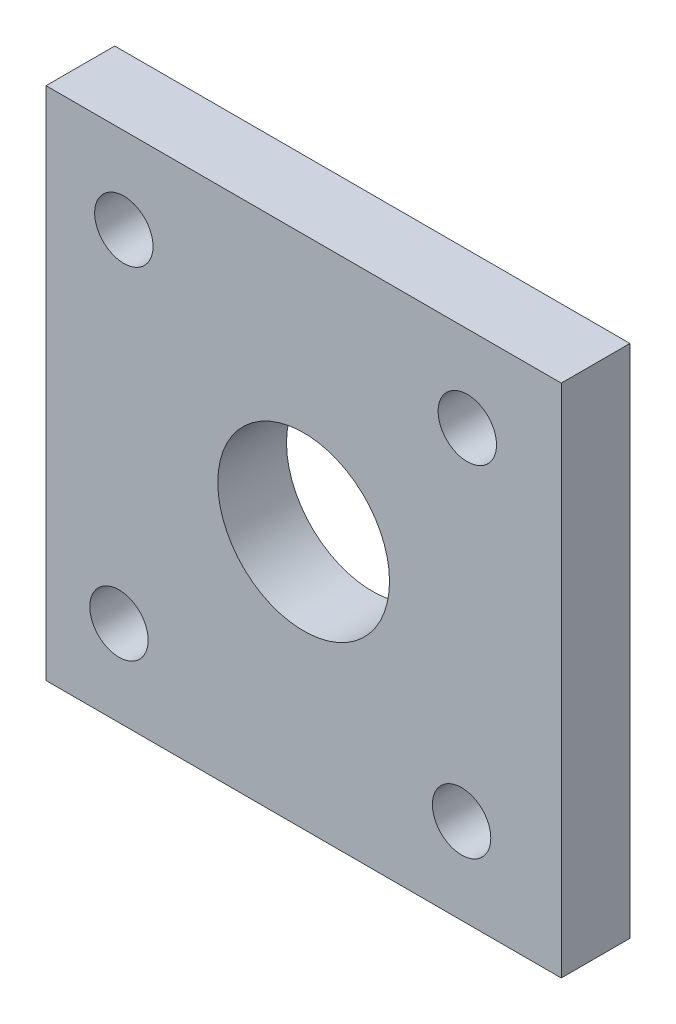
ISO-10303-21;
HEADER;
FILE_DESCRIPTION(('STEP AP214'),'2;1');
FILE_NAME('part.step','',(''),(''),'','','');
FILE_SCHEMA(('AUTOMOTIVE_DESIGN { 1 0 10303 214 1 1 1 1 }'));
ENDSEC;
DATA;
#1=APPLICATION_CONTEXT('core data for automotive mechanical design processes');
#2=APPLICATION_PROTOCOL_DEFINITION('international standard','automotive_design',2000,#1);
#3=PRODUCT_CONTEXT('',#1,'mechanical');
#4=PRODUCT('Part','Part','',(#3));
#5=PRODUCT_RELATED_PRODUCT_CATEGORY('part','',(#4));
#6=PRODUCT_DEFINITION_FORMATION('','',#4);
#7=PRODUCT_DEFINITION_CONTEXT('part definition',#1,'design');
#8=PRODUCT_DEFINITION('design','',#6,#7);
#9=PRODUCT_DEFINITION_SHAPE('','',#8);
#10=(LENGTH_UNIT() NAMED_UNIT(*) SI_UNIT(.MILLI.,.METRE.));
#11=(NAMED_UNIT(*) PLANE_ANGLE_UNIT() SI_UNIT($,.RADIAN.));
#12=(NAMED_UNIT(*) SI_UNIT($,.STERADIAN.) SOLID_ANGLE_UNIT());
#13=UNCERTAINTY_MEASURE_WITH_UNIT(LENGTH_MEASURE(1.E-05),#10,'distance_accuracy_value','');
#14=(GEOMETRIC_REPRESENTATION_CONTEXT(3) GLOBAL_UNCERTAINTY_ASSIGNED_CONTEXT((#13)) GLOBAL_UNIT_ASSIGNED_CONTEXT((#10,
#11,#12)) REPRESENTATION_CONTEXT('',''));
#15=CARTESIAN_POINT('',(0.,0.,0.));
#16=DIRECTION('',(0.,0.,1.));
#17=DIRECTION('',(1.,0.,0.));
#18=AXIS2_PLACEMENT_3D('',#15,#16,#17);
#19=CARTESIAN_POINT('',(-13.8771593090211,14.5393474088292,4.));
#20=DIRECTION('',(1.,0.,0.));
#21=DIRECTION('',(0.,1.,0.));
#22=AXIS2_PLACEMENT_3D('',#19,#20,#21);
#23=PLANE('',#22);
#24=DIRECTION('',(0.,-1.,0.));
#25=VECTOR('',#24,1.);
#26=CARTESIAN_POINT('',(-13.8771593090211,14.5393474088292,0.));
#27=LINE('',#26,#25);
#28=CARTESIAN_POINT('',(-13.8771593090211,14.5393474088292,0.));
#29=VERTEX_POINT('',#28);
#30=CARTESIAN_POINT('',(-13.8771593090211,-15.4606525911708,0.));
#31=VERTEX_POINT('',#30);
#32=EDGE_CURVE('E105',#29,#31,#27,.T.);
#33=ORIENTED_EDGE('',*,*,#32,.T.);
#34=DIRECTION('',(0.,0.,-1.));
#35=VECTOR('',#34,1.);
#36=CARTESIAN_POINT('',(-13.8771593090211,-15.4606525911708,4.));
#37=LINE('',#36,#35);
#38=CARTESIAN_POINT('',(-13.8771593090211,-15.4606525911708,4.));
#39=VERTEX_POINT('',#38);
#40=EDGE_CURVE('E11',#39,#31,#37,.T.);
#41=ORIENTED_EDGE('',*,*,#40,.F.);
#42=DIRECTION('',(0.,-1.,0.));
#43=VECTOR('',#42,1.);
#44=CARTESIAN_POINT('',(-13.8771593090211,14.5393474088292,4.));
#45=LINE('',#44,#43);
#46=CARTESIAN_POINT('',(-13.8771593090211,14.5393474088292,4.));
#47=VERTEX_POINT('',#46);
#48=EDGE_CURVE('E89',#47,#39,#45,.T.);
#49=ORIENTED_EDGE('',*,*,#48,.F.);
#50=DIRECTION('',(0.,0.,-1.));
#51=VECTOR('',#50,1.);
#52=CARTESIAN_POINT('',(-13.8771593090211,14.5393474088292,4.));
#53=LINE('',#52,#51);
#54=EDGE_CURVE('E98',#47,#29,#53,.T.);
#55=ORIENTED_EDGE('',*,*,#54,.T.);
#56=EDGE_LOOP('',(#33,#41,#49,#55));
#57=FACE_BOUND('',#56,.T.);
#58=ADVANCED_FACE('F39',(#57),#23,.F.);
#59=CARTESIAN_POINT('',(-13.8771593090211,-15.4606525911708,4.));
#60=DIRECTION('',(0.,1.,0.));
#61=DIRECTION('',(0.,0.,1.));
#62=AXIS2_PLACEMENT_3D('',#59,#60,#61);
#63=PLANE('',#62);
#64=DIRECTION('',(1.,0.,0.));
#65=VECTOR('',#64,1.);
#66=CARTESIAN_POINT('',(-13.8771593090211,-15.4606525911708,0.));
#67=LINE('',#66,#65);
#68=CARTESIAN_POINT('',(16.1228406909789,-15.4606525911708,0.));
#69=VERTEX_POINT('',#68);
#70=EDGE_CURVE('E94',#31,#69,#67,.T.);
#71=ORIENTED_EDGE('',*,*,#70,.T.);
#72=DIRECTION('',(0.,0.,-1.));
#73=VECTOR('',#72,1.);
#74=CARTESIAN_POINT('',(16.1228406909789,-15.4606525911708,4.));
#75=LINE('',#74,#73);
#76=CARTESIAN_POINT('',(16.1228406909789,-15.4606525911708,4.));
#77=VERTEX_POINT('',#76);
#78=EDGE_CURVE('E50',#77,#69,#75,.T.);
#79=ORIENTED_EDGE('',*,*,#78,.F.);
#80=DIRECTION('',(1.,0.,0.));
#81=VECTOR('',#80,1.);
#82=CARTESIAN_POINT('',(-13.8771593090211,-15.4606525911708,4.));
#83=LINE('',#82,#81);
#84=EDGE_CURVE('E82',#39,#77,#83,.T.);
#85=ORIENTED_EDGE('',*,*,#84,.F.);
#86=ORIENTED_EDGE('',*,*,#40,.T.);
#87=EDGE_LOOP('',(#71,#79,#85,#86));
#88=FACE_BOUND('',#87,.T.);
#89=ADVANCED_FACE('F91',(#88),#63,.F.);
#90=CARTESIAN_POINT('',(16.1228406909789,14.5393474088292,4.));
#91=DIRECTION('',(-1.,0.,0.));
#92=DIRECTION('',(0.,0.,1.));
#93=AXIS2_PLACEMENT_3D('',#90,#91,#92);
#94=PLANE('',#93);
#95=DIRECTION('',(0.,1.,0.));
#96=VECTOR('',#95,1.);
#97=CARTESIAN_POINT('',(16.1228406909789,14.5393474088292,0.));
#98=LINE('',#97,#96);
#99=CARTESIAN_POINT('',(16.1228406909789,14.5393474088292,0.));
#100=VERTEX_POINT('',#99);
#101=EDGE_CURVE('E75',#69,#100,#98,.T.);
#102=ORIENTED_EDGE('',*,*,#101,.T.);
#103=DIRECTION('',(0.,0.,-1.));
#104=VECTOR('',#103,1.);
#105=CARTESIAN_POINT('',(16.1228406909789,14.5393474088292,4.));
#106=LINE('',#105,#104);
#107=CARTESIAN_POINT('',(16.1228406909789,14.5393474088292,4.));
#108=VERTEX_POINT('',#107);
#109=EDGE_CURVE('E92',#108,#100,#106,.T.);
#110=ORIENTED_EDGE('',*,*,#109,.F.);
#111=DIRECTION('',(0.,1.,0.));
#112=VECTOR('',#111,1.);
#113=CARTESIAN_POINT('',(16.1228406909789,14.5393474088292,4.));
#114=LINE('',#113,#112);
#115=EDGE_CURVE('E86',#77,#108,#114,.T.);
#116=ORIENTED_EDGE('',*,*,#115,.F.);
#117=ORIENTED_EDGE('',*,*,#78,.T.);
#118=EDGE_LOOP('',(#102,#110,#116,#117));
#119=FACE_BOUND('',#118,.T.);
#120=ADVANCED_FACE('F96',(#119),#94,.F.);
#121=CARTESIAN_POINT('',(-13.8771593090211,14.5393474088292,4.));
#122=DIRECTION('',(0.,-1.,0.));
#123=DIRECTION('',(0.,0.,-1.));
#124=AXIS2_PLACEMENT_3D('',#121,#122,#123);
#125=PLANE('',#124);
#126=DIRECTION('',(-1.,0.,0.));
#127=VECTOR('',#126,1.);
#128=CARTESIAN_POINT('',(-13.8771593090211,14.5393474088292,0.));
#129=LINE('',#128,#127);
#130=EDGE_CURVE('E79',#100,#29,#129,.T.);
#131=ORIENTED_EDGE('',*,*,#130,.T.);
#132=ORIENTED_EDGE('',*,*,#54,.F.);
#133=DIRECTION('',(-1.,0.,0.));
#134=VECTOR('',#133,1.);
#135=CARTESIAN_POINT('',(-13.8771593090211,14.5393474088292,4.));
#136=LINE('',#135,#134);
#137=EDGE_CURVE('E54',#108,#47,#136,.T.);
#138=ORIENTED_EDGE('',*,*,#137,.F.);
#139=ORIENTED_EDGE('',*,*,#109,.T.);
#140=EDGE_LOOP('',(#131,#132,#138,#139));
#141=FACE_BOUND('',#140,.T.);
#142=ADVANCED_FACE('F109',(#141),#125,.F.);
#143=CARTESIAN_POINT('',(0.,0.,4.));
#144=DIRECTION('',(0.,0.,1.));
#145=DIRECTION('',(1.,0.,0.));
#146=AXIS2_PLACEMENT_3D('',#143,#144,#145);
#147=PLANE('',#146);
#148=CARTESIAN_POINT('',(10.652018490448,9.53934740882917,4.));
#149=DIRECTION('',(0.,0.,1.));
#150=DIRECTION('',(1.,0.,0.));
#151=AXIS2_PLACEMENT_3D('',#148,#149,#150);
#152=CIRCLE('',#151,1.7);
#153=CARTESIAN_POINT('',(12.352018490448,9.53934740882917,4.));
#154=VERTEX_POINT('',#153);
#155=EDGE_CURVE('E122',#154,#154,#152,.T.);
#156=ORIENTED_EDGE('',*,*,#155,.F.);
#157=EDGE_LOOP('',(#156));
#158=FACE_BOUND('',#157,.T.);
#159=CARTESIAN_POINT('',(-9.6309767041609,-10.4606525911708,4.));
#160=DIRECTION('',(0.,0.,1.));
#161=DIRECTION('',(1.,0.,0.));
#162=AXIS2_PLACEMENT_3D('',#159,#160,#161);
#163=CIRCLE('',#162,1.7);
#164=CARTESIAN_POINT('',(-7.9309767041609,-10.4606525911708,4.));
#165=VERTEX_POINT('',#164);
#166=EDGE_CURVE('E132',#165,#165,#163,.T.);
#167=ORIENTED_EDGE('',*,*,#166,.F.);
#168=EDGE_LOOP('',(#167));
#169=FACE_BOUND('',#168,.T.);
#170=CARTESIAN_POINT('',(10.3201845157695,-10.4606525911708,4.));
#171=DIRECTION('',(0.,0.,1.));
#172=DIRECTION('',(1.,0.,0.));
#173=AXIS2_PLACEMENT_3D('',#170,#171,#172);
#174=CIRCLE('',#173,1.7);
#175=CARTESIAN_POINT('',(12.0201845157695,-10.4606525911708,4.));
#176=VERTEX_POINT('',#175);
#177=EDGE_CURVE('E135',#176,#176,#174,.T.);
#178=ORIENTED_EDGE('',*,*,#177,.F.);
#179=EDGE_LOOP('',(#178));
#180=FACE_BOUND('',#179,.T.);
#181=CARTESIAN_POINT('',(-9.34798150955196,9.53934740882917,4.));
#182=DIRECTION('',(0.,0.,1.));
#183=DIRECTION('',(1.,0.,0.));
#184=AXIS2_PLACEMENT_3D('',#181,#182,#183);
#185=CIRCLE('',#184,1.7);
#186=CARTESIAN_POINT('',(-7.64798150955195,9.53934740882917,4.));
#187=VERTEX_POINT('',#186);
#188=EDGE_CURVE('E121',#187,#187,#185,.T.);
#189=ORIENTED_EDGE('',*,*,#188,.F.);
#190=EDGE_LOOP('',(#189));
#191=FACE_BOUND('',#190,.T.);
#192=CARTESIAN_POINT('',(1.12284069097888,-0.460652591170828,4.));
#193=DIRECTION('',(0.,0.,1.));
#194=DIRECTION('',(1.,0.,0.));
#195=AXIS2_PLACEMENT_3D('',#192,#193,#194);
#196=CIRCLE('',#195,5.);
#197=CARTESIAN_POINT('',(6.12284069097888,-0.460652591170828,4.));
#198=VERTEX_POINT('',#197);
#199=EDGE_CURVE('E117',#198,#198,#196,.T.);
#200=ORIENTED_EDGE('',*,*,#199,.F.);
#201=EDGE_LOOP('',(#200));
#202=FACE_BOUND('',#201,.T.);
#203=ORIENTED_EDGE('',*,*,#48,.T.);
#204=ORIENTED_EDGE('',*,*,#84,.T.);
#205=ORIENTED_EDGE('',*,*,#115,.T.);
#206=ORIENTED_EDGE('',*,*,#137,.T.);
#207=EDGE_LOOP('',(#203,#204,#205,#206));
#208=FACE_BOUND('',#207,.T.);
#209=ADVANCED_FACE('F88',(#158,#169,#180,#191,#202,#208),#147,.T.);
#210=CARTESIAN_POINT('',(0.,0.,0.));
#211=DIRECTION('',(0.,0.,1.));
#212=DIRECTION('',(1.,0.,0.));
#213=AXIS2_PLACEMENT_3D('',#210,#211,#212);
#214=PLANE('',#213);
#215=CARTESIAN_POINT('',(10.652018490448,9.53934740882917,0.));
#216=DIRECTION('',(0.,0.,1.));
#217=DIRECTION('',(1.,0.,0.));
#218=AXIS2_PLACEMENT_3D('',#215,#216,#217);
#219=CIRCLE('',#218,1.7);
#220=CARTESIAN_POINT('',(12.352018490448,9.53934740882917,0.));
#221=VERTEX_POINT('',#220);
#222=EDGE_CURVE('E133',#221,#221,#219,.T.);
#223=ORIENTED_EDGE('',*,*,#222,.T.);
#224=EDGE_LOOP('',(#223));
#225=FACE_BOUND('',#224,.T.);
#226=CARTESIAN_POINT('',(-9.6309767041609,-10.4606525911708,0.));
#227=DIRECTION('',(0.,0.,1.));
#228=DIRECTION('',(1.,0.,0.));
#229=AXIS2_PLACEMENT_3D('',#226,#227,#228);
#230=CIRCLE('',#229,1.7);
#231=CARTESIAN_POINT('',(-7.9309767041609,-10.4606525911708,0.));
#232=VERTEX_POINT('',#231);
#233=EDGE_CURVE('E126',#232,#232,#230,.T.);
#234=ORIENTED_EDGE('',*,*,#233,.T.);
#235=EDGE_LOOP('',(#234));
#236=FACE_BOUND('',#235,.T.);
#237=CARTESIAN_POINT('',(10.3201845157695,-10.4606525911708,0.));
#238=DIRECTION('',(0.,0.,1.));
#239=DIRECTION('',(1.,0.,0.));
#240=AXIS2_PLACEMENT_3D('',#237,#238,#239);
#241=CIRCLE('',#240,1.7);
#242=CARTESIAN_POINT('',(12.0201845157695,-10.4606525911708,0.));
#243=VERTEX_POINT('',#242);
#244=EDGE_CURVE('E137',#243,#243,#241,.T.);
#245=ORIENTED_EDGE('',*,*,#244,.T.);
#246=EDGE_LOOP('',(#245));
#247=FACE_BOUND('',#246,.T.);
#248=CARTESIAN_POINT('',(-9.34798150955196,9.53934740882917,0.));
#249=DIRECTION('',(0.,0.,1.));
#250=DIRECTION('',(1.,0.,0.));
#251=AXIS2_PLACEMENT_3D('',#248,#249,#250);
#252=CIRCLE('',#251,1.7);
#253=CARTESIAN_POINT('',(-7.64798150955195,9.53934740882917,0.));
#254=VERTEX_POINT('',#253);
#255=EDGE_CURVE('E116',#254,#254,#252,.T.);
#256=ORIENTED_EDGE('',*,*,#255,.T.);
#257=EDGE_LOOP('',(#256));
#258=FACE_BOUND('',#257,.T.);
#259=CARTESIAN_POINT('',(1.12284069097888,-0.460652591170828,0.));
#260=DIRECTION('',(0.,0.,1.));
#261=DIRECTION('',(1.,0.,0.));
#262=AXIS2_PLACEMENT_3D('',#259,#260,#261);
#263=CIRCLE('',#262,5.);
#264=CARTESIAN_POINT('',(6.12284069097888,-0.460652591170828,0.));
#265=VERTEX_POINT('',#264);
#266=EDGE_CURVE('E104',#265,#265,#263,.T.);
#267=ORIENTED_EDGE('',*,*,#266,.T.);
#268=EDGE_LOOP('',(#267));
#269=FACE_BOUND('',#268,.T.);
#270=ORIENTED_EDGE('',*,*,#32,.F.);
#271=ORIENTED_EDGE('',*,*,#130,.F.);
#272=ORIENTED_EDGE('',*,*,#101,.F.);
#273=ORIENTED_EDGE('',*,*,#70,.F.);
#274=EDGE_LOOP('',(#270,#271,#272,#273));
#275=FACE_BOUND('',#274,.T.);
#276=ADVANCED_FACE('F114',(#225,#236,#247,#258,#269,#275),#214,.F.);
#277=CARTESIAN_POINT('',(1.12284069097888,-0.460652591170828,0.));
#278=DIRECTION('',(0.,0.,1.));
#279=DIRECTION('',(1.,0.,0.));
#280=AXIS2_PLACEMENT_3D('',#277,#278,#279);
#281=CYLINDRICAL_SURFACE('',#280,5.);
#282=ORIENTED_EDGE('',*,*,#266,.F.);
#283=EDGE_LOOP('',(#282));
#284=FACE_BOUND('',#283,.T.);
#285=ORIENTED_EDGE('',*,*,#199,.T.);
#286=EDGE_LOOP('',(#285));
#287=FACE_BOUND('',#286,.T.);
#288=ADVANCED_FACE('F156',(#284,#287),#281,.F.);
#289=CARTESIAN_POINT('',(-9.34798150955196,9.53934740882917,0.));
#290=DIRECTION('',(0.,0.,1.));
#291=DIRECTION('',(1.,0.,0.));
#292=AXIS2_PLACEMENT_3D('',#289,#290,#291);
#293=CYLINDRICAL_SURFACE('',#292,1.7);
#294=ORIENTED_EDGE('',*,*,#255,.F.);
#295=EDGE_LOOP('',(#294));
#296=FACE_BOUND('',#295,.T.);
#297=ORIENTED_EDGE('',*,*,#188,.T.);
#298=EDGE_LOOP('',(#297));
#299=FACE_BOUND('',#298,.T.);
#300=ADVANCED_FACE('F158',(#296,#299),#293,.F.);
#301=CARTESIAN_POINT('',(10.3201845157695,-10.4606525911708,0.));
#302=DIRECTION('',(0.,0.,1.));
#303=DIRECTION('',(1.,0.,0.));
#304=AXIS2_PLACEMENT_3D('',#301,#302,#303);
#305=CYLINDRICAL_SURFACE('',#304,1.7);
#306=ORIENTED_EDGE('',*,*,#244,.F.);
#307=EDGE_LOOP('',(#306));
#308=FACE_BOUND('',#307,.T.);
#309=ORIENTED_EDGE('',*,*,#177,.T.);
#310=EDGE_LOOP('',(#309));
#311=FACE_BOUND('',#310,.T.);
#312=ADVANCED_FACE('F148',(#308,#311),#305,.F.);
#313=CARTESIAN_POINT('',(-9.6309767041609,-10.4606525911708,0.));
#314=DIRECTION('',(0.,0.,1.));
#315=DIRECTION('',(1.,0.,0.));
#316=AXIS2_PLACEMENT_3D('',#313,#314,#315);
#317=CYLINDRICAL_SURFACE('',#316,1.7);
#318=ORIENTED_EDGE('',*,*,#233,.F.);
#319=EDGE_LOOP('',(#318));
#320=FACE_BOUND('',#319,.T.);
#321=ORIENTED_EDGE('',*,*,#166,.T.);
#322=EDGE_LOOP('',(#321));
#323=FACE_BOUND('',#322,.T.);
#324=ADVANCED_FACE('F221',(#320,#323),#317,.F.);
#325=CARTESIAN_POINT('',(10.652018490448,9.53934740882917,0.));
#326=DIRECTION('',(0.,0.,1.));
#327=DIRECTION('',(1.,0.,0.));
#328=AXIS2_PLACEMENT_3D('',#325,#326,#327);
#329=CYLINDRICAL_SURFACE('',#328,1.7);
#330=ORIENTED_EDGE('',*,*,#222,.F.);
#331=EDGE_LOOP('',(#330));
#332=FACE_BOUND('',#331,.T.);
#333=ORIENTED_EDGE('',*,*,#155,.T.);
#334=EDGE_LOOP('',(#333));
#335=FACE_BOUND('',#334,.T.);
#336=ADVANCED_FACE('F235',(#332,#335),#329,.F.);
#337=CLOSED_SHELL('',(#58,#89,#120,#142,#209,#276,#288,#300,#312,#324,#336));
#338=MANIFOLD_SOLID_BREP('B2',#337);
#339=ADVANCED_BREP_SHAPE_REPRESENTATION('',(#18,#338),#14);
#340=SHAPE_DEFINITION_REPRESENTATION(#9,#339);
ENDSEC;
END-ISO-10303-21;
